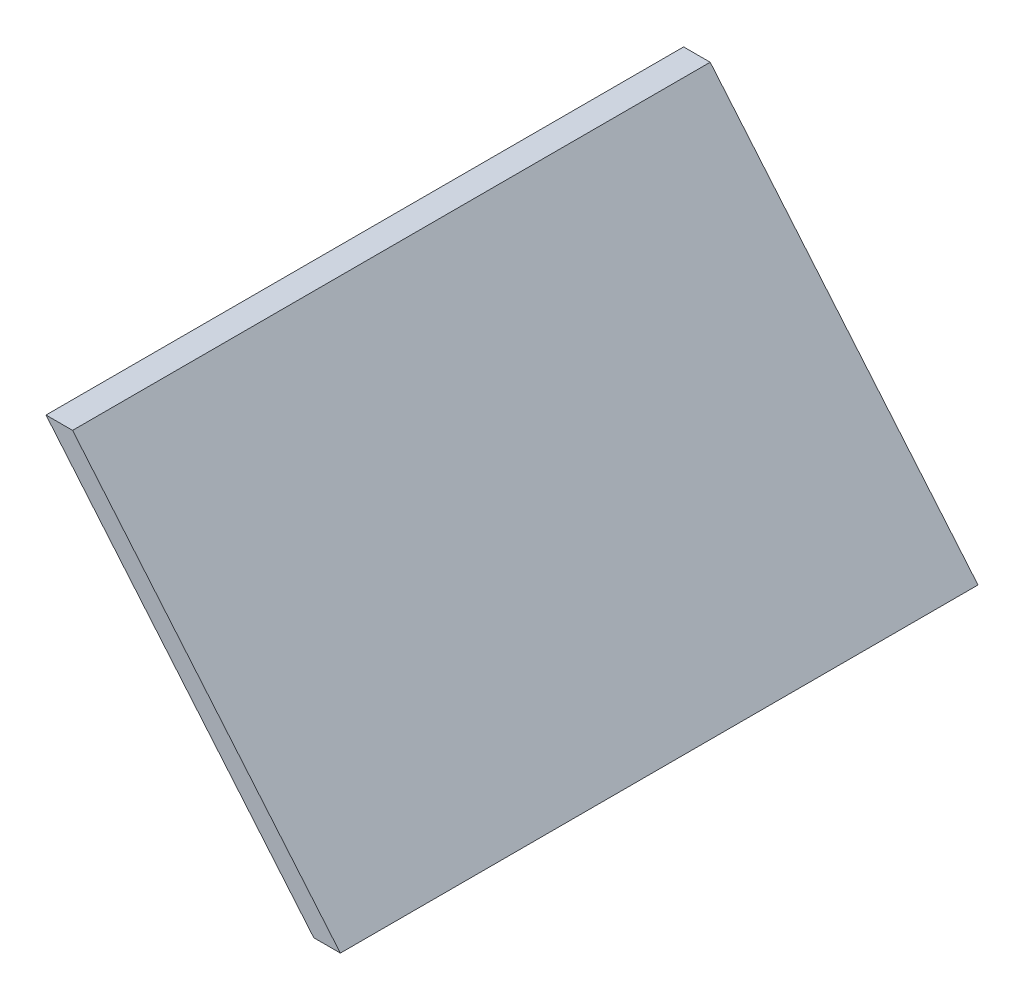
ISO-10303-21;
HEADER;
FILE_DESCRIPTION(('STEP AP214'),'2;1');
FILE_NAME('part.step','',(''),(''),'','','');
FILE_SCHEMA(('AUTOMOTIVE_DESIGN { 1 0 10303 214 1 1 1 1 }'));
ENDSEC;
DATA;
#1=APPLICATION_CONTEXT('core data for automotive mechanical design processes');
#2=APPLICATION_PROTOCOL_DEFINITION('international standard','automotive_design',2000,#1);
#3=PRODUCT_CONTEXT('',#1,'mechanical');
#4=PRODUCT('Part','Part','',(#3));
#5=PRODUCT_RELATED_PRODUCT_CATEGORY('part','',(#4));
#6=PRODUCT_DEFINITION_FORMATION('','',#4);
#7=PRODUCT_DEFINITION_CONTEXT('part definition',#1,'design');
#8=PRODUCT_DEFINITION('design','',#6,#7);
#9=PRODUCT_DEFINITION_SHAPE('','',#8);
#10=(LENGTH_UNIT() NAMED_UNIT(*) SI_UNIT(.MILLI.,.METRE.));
#11=(NAMED_UNIT(*) PLANE_ANGLE_UNIT() SI_UNIT($,.RADIAN.));
#12=(NAMED_UNIT(*) SI_UNIT($,.STERADIAN.) SOLID_ANGLE_UNIT());
#13=UNCERTAINTY_MEASURE_WITH_UNIT(LENGTH_MEASURE(1.E-05),#10,'distance_accuracy_value','');
#14=(GEOMETRIC_REPRESENTATION_CONTEXT(3) GLOBAL_UNCERTAINTY_ASSIGNED_CONTEXT((#13)) GLOBAL_UNIT_ASSIGNED_CONTEXT((#10,
#11,#12)) REPRESENTATION_CONTEXT('',''));
#15=CARTESIAN_POINT('',(0.,0.,0.));
#16=DIRECTION('',(0.,0.,1.));
#17=DIRECTION('',(1.,0.,0.));
#18=AXIS2_PLACEMENT_3D('',#15,#16,#17);
#19=CARTESIAN_POINT('',(-19.177,38.1,38.1));
#20=DIRECTION('',(0.765704864789611,0.643192086423273,0.));
#21=DIRECTION('',(-0.643192086423273,0.765704864789611,0.));
#22=AXIS2_PLACEMENT_3D('',#19,#20,#21);
#23=PLANE('',#22);
#24=DIRECTION('',(0.,0.,1.));
#25=VECTOR('',#24,1.);
#26=CARTESIAN_POINT('',(12.827,0.,38.1));
#27=LINE('',#26,#25);
#28=CARTESIAN_POINT('',(12.827,0.,-38.1));
#29=VERTEX_POINT('',#28);
#30=CARTESIAN_POINT('',(12.827,0.,38.1));
#31=VERTEX_POINT('',#30);
#32=EDGE_CURVE('E20',#29,#31,#27,.T.);
#33=ORIENTED_EDGE('',*,*,#32,.T.);
#34=DIRECTION('',(0.643192086423273,-0.765704864789611,0.));
#35=VECTOR('',#34,1.);
#36=CARTESIAN_POINT('',(-19.177,38.1,38.1));
#37=LINE('',#36,#35);
#38=CARTESIAN_POINT('',(-19.177,38.1,38.1));
#39=VERTEX_POINT('',#38);
#40=EDGE_CURVE('E55',#39,#31,#37,.T.);
#41=ORIENTED_EDGE('',*,*,#40,.F.);
#42=DIRECTION('',(0.,0.,-1.));
#43=VECTOR('',#42,1.);
#44=CARTESIAN_POINT('',(-19.177,38.1,38.1));
#45=LINE('',#44,#43);
#46=CARTESIAN_POINT('',(-19.177,38.1,-38.1));
#47=VERTEX_POINT('',#46);
#48=EDGE_CURVE('E75',#39,#47,#45,.T.);
#49=ORIENTED_EDGE('',*,*,#48,.T.);
#50=DIRECTION('',(0.643192086423273,-0.765704864789611,0.));
#51=VECTOR('',#50,1.);
#52=CARTESIAN_POINT('',(-19.177,38.1,-38.1));
#53=LINE('',#52,#51);
#54=EDGE_CURVE('E66',#47,#29,#53,.T.);
#55=ORIENTED_EDGE('',*,*,#54,.T.);
#56=EDGE_LOOP('',(#33,#41,#49,#55));
#57=FACE_BOUND('',#56,.T.);
#58=ADVANCED_FACE('F17',(#57),#23,.F.);
#59=CARTESIAN_POINT('',(16.002,0.,38.1));
#60=DIRECTION('',(0.,1.,0.));
#61=DIRECTION('',(-1.,0.,0.));
#62=AXIS2_PLACEMENT_3D('',#59,#60,#61);
#63=PLANE('',#62);
#64=DIRECTION('',(0.,0.,1.));
#65=VECTOR('',#64,1.);
#66=CARTESIAN_POINT('',(16.002,0.,38.1));
#67=LINE('',#66,#65);
#68=CARTESIAN_POINT('',(16.002,0.,-38.1));
#69=VERTEX_POINT('',#68);
#70=CARTESIAN_POINT('',(16.002,0.,38.1));
#71=VERTEX_POINT('',#70);
#72=EDGE_CURVE('E73',#69,#71,#67,.T.);
#73=ORIENTED_EDGE('',*,*,#72,.T.);
#74=DIRECTION('',(1.,0.,0.));
#75=VECTOR('',#74,1.);
#76=CARTESIAN_POINT('',(0.,0.,38.1));
#77=LINE('',#76,#75);
#78=EDGE_CURVE('E62',#31,#71,#77,.T.);
#79=ORIENTED_EDGE('',*,*,#78,.F.);
#80=ORIENTED_EDGE('',*,*,#32,.F.);
#81=DIRECTION('',(1.,0.,0.));
#82=VECTOR('',#81,1.);
#83=CARTESIAN_POINT('',(0.,0.,-38.1));
#84=LINE('',#83,#82);
#85=EDGE_CURVE('E81',#29,#69,#84,.T.);
#86=ORIENTED_EDGE('',*,*,#85,.T.);
#87=EDGE_LOOP('',(#73,#79,#80,#86));
#88=FACE_BOUND('',#87,.T.);
#89=ADVANCED_FACE('F72',(#88),#63,.F.);
#90=CARTESIAN_POINT('',(0.,0.,38.1));
#91=DIRECTION('',(0.,0.,1.));
#92=DIRECTION('',(1.,0.,0.));
#93=AXIS2_PLACEMENT_3D('',#90,#91,#92);
#94=PLANE('',#93);
#95=ORIENTED_EDGE('',*,*,#78,.T.);
#96=DIRECTION('',(0.643192086423273,-0.765704864789611,0.));
#97=VECTOR('',#96,1.);
#98=CARTESIAN_POINT('',(-16.002,38.1,38.1));
#99=LINE('',#98,#97);
#100=CARTESIAN_POINT('',(-16.002,38.1,38.1));
#101=VERTEX_POINT('',#100);
#102=EDGE_CURVE('E86',#71,#101,#99,.F.);
#103=ORIENTED_EDGE('',*,*,#102,.T.);
#104=DIRECTION('',(1.,0.,0.));
#105=VECTOR('',#104,1.);
#106=CARTESIAN_POINT('',(-16.002,38.1,38.1));
#107=LINE('',#106,#105);
#108=EDGE_CURVE('E64',#101,#39,#107,.F.);
#109=ORIENTED_EDGE('',*,*,#108,.T.);
#110=ORIENTED_EDGE('',*,*,#40,.T.);
#111=EDGE_LOOP('',(#95,#103,#109,#110));
#112=FACE_BOUND('',#111,.T.);
#113=ADVANCED_FACE('F59',(#112),#94,.T.);
#114=CARTESIAN_POINT('',(-16.002,38.1,38.1));
#115=DIRECTION('',(0.,-1.,0.));
#116=DIRECTION('',(0.,0.,-1.));
#117=AXIS2_PLACEMENT_3D('',#114,#115,#116);
#118=PLANE('',#117);
#119=ORIENTED_EDGE('',*,*,#48,.F.);
#120=ORIENTED_EDGE('',*,*,#108,.F.);
#121=DIRECTION('',(0.,0.,1.));
#122=VECTOR('',#121,1.);
#123=CARTESIAN_POINT('',(-16.002,38.1,38.1));
#124=LINE('',#123,#122);
#125=CARTESIAN_POINT('',(-16.002,38.1,-38.1));
#126=VERTEX_POINT('',#125);
#127=EDGE_CURVE('E26',#101,#126,#124,.F.);
#128=ORIENTED_EDGE('',*,*,#127,.T.);
#129=DIRECTION('',(1.,0.,0.));
#130=VECTOR('',#129,1.);
#131=CARTESIAN_POINT('',(0.,38.1,-38.1));
#132=LINE('',#131,#130);
#133=EDGE_CURVE('E34',#126,#47,#132,.F.);
#134=ORIENTED_EDGE('',*,*,#133,.T.);
#135=EDGE_LOOP('',(#119,#120,#128,#134));
#136=FACE_BOUND('',#135,.T.);
#137=ADVANCED_FACE('F93',(#136),#118,.F.);
#138=CARTESIAN_POINT('',(0.,0.,-38.1));
#139=DIRECTION('',(0.,0.,1.));
#140=DIRECTION('',(1.,0.,0.));
#141=AXIS2_PLACEMENT_3D('',#138,#139,#140);
#142=PLANE('',#141);
#143=DIRECTION('',(0.643192086423273,-0.765704864789611,0.));
#144=VECTOR('',#143,1.);
#145=CARTESIAN_POINT('',(-16.002,38.1,-38.1));
#146=LINE('',#145,#144);
#147=EDGE_CURVE('E11',#126,#69,#146,.T.);
#148=ORIENTED_EDGE('',*,*,#147,.T.);
#149=ORIENTED_EDGE('',*,*,#85,.F.);
#150=ORIENTED_EDGE('',*,*,#54,.F.);
#151=ORIENTED_EDGE('',*,*,#133,.F.);
#152=EDGE_LOOP('',(#148,#149,#150,#151));
#153=FACE_BOUND('',#152,.T.);
#154=ADVANCED_FACE('F96',(#153),#142,.F.);
#155=CARTESIAN_POINT('',(-16.002,38.1,38.1));
#156=DIRECTION('',(-0.765704864789611,-0.643192086423273,0.));
#157=DIRECTION('',(0.643192086423273,-0.765704864789611,0.));
#158=AXIS2_PLACEMENT_3D('',#155,#156,#157);
#159=PLANE('',#158);
#160=ORIENTED_EDGE('',*,*,#127,.F.);
#161=ORIENTED_EDGE('',*,*,#102,.F.);
#162=ORIENTED_EDGE('',*,*,#72,.F.);
#163=ORIENTED_EDGE('',*,*,#147,.F.);
#164=EDGE_LOOP('',(#160,#161,#162,#163));
#165=FACE_BOUND('',#164,.T.);
#166=ADVANCED_FACE('F95',(#165),#159,.F.);
#167=CLOSED_SHELL('',(#58,#89,#113,#137,#154,#166));
#168=MANIFOLD_SOLID_BREP('B1',#167);
#169=ADVANCED_BREP_SHAPE_REPRESENTATION('',(#18,#168),#14);
#170=SHAPE_DEFINITION_REPRESENTATION(#9,#169);
ENDSEC;
END-ISO-10303-21;
